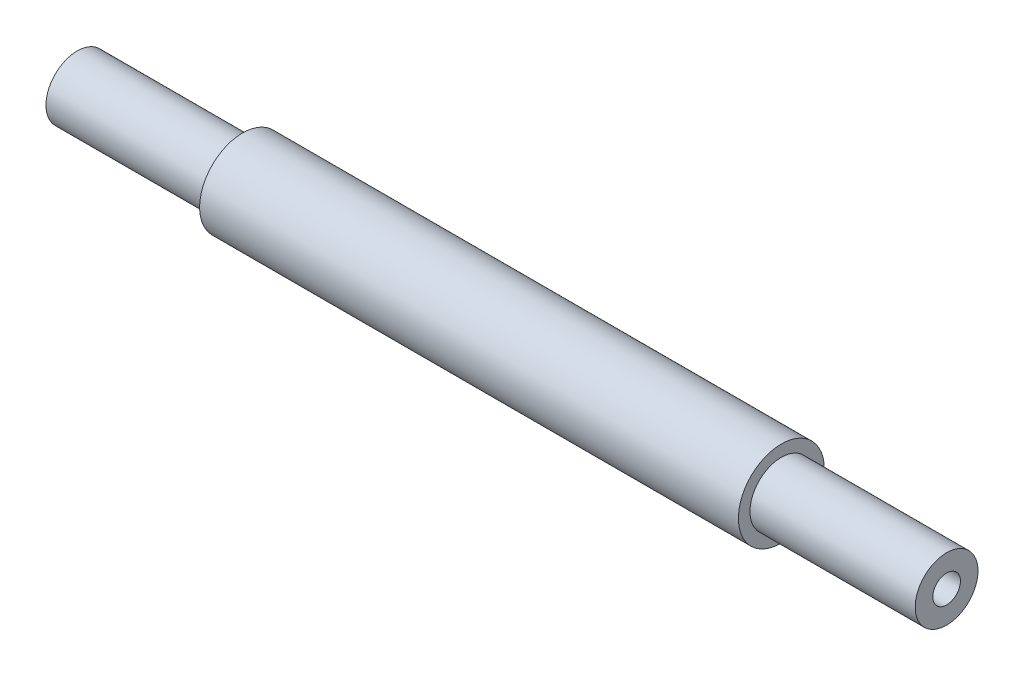
ISO-10303-21;
HEADER;
FILE_DESCRIPTION(('STEP AP214'),'2;1');
FILE_NAME('part.step','',(''),(''),'','','');
FILE_SCHEMA(('AUTOMOTIVE_DESIGN { 1 0 10303 214 1 1 1 1 }'));
ENDSEC;
DATA;
#1=APPLICATION_CONTEXT('core data for automotive mechanical design processes');
#2=APPLICATION_PROTOCOL_DEFINITION('international standard','automotive_design',2000,#1);
#3=PRODUCT_CONTEXT('',#1,'mechanical');
#4=PRODUCT('Part','Part','',(#3));
#5=PRODUCT_RELATED_PRODUCT_CATEGORY('part','',(#4));
#6=PRODUCT_DEFINITION_FORMATION('','',#4);
#7=PRODUCT_DEFINITION_CONTEXT('part definition',#1,'design');
#8=PRODUCT_DEFINITION('design','',#6,#7);
#9=PRODUCT_DEFINITION_SHAPE('','',#8);
#10=(LENGTH_UNIT() NAMED_UNIT(*) SI_UNIT(.MILLI.,.METRE.));
#11=(NAMED_UNIT(*) PLANE_ANGLE_UNIT() SI_UNIT($,.RADIAN.));
#12=(NAMED_UNIT(*) SI_UNIT($,.STERADIAN.) SOLID_ANGLE_UNIT());
#13=UNCERTAINTY_MEASURE_WITH_UNIT(LENGTH_MEASURE(1.E-05),#10,'distance_accuracy_value','');
#14=(GEOMETRIC_REPRESENTATION_CONTEXT(3) GLOBAL_UNCERTAINTY_ASSIGNED_CONTEXT((#13)) GLOBAL_UNIT_ASSIGNED_CONTEXT((#10,
#11,#12)) REPRESENTATION_CONTEXT('',''));
#15=CARTESIAN_POINT('',(0.,0.,0.));
#16=DIRECTION('',(0.,0.,1.));
#17=DIRECTION('',(1.,0.,0.));
#18=AXIS2_PLACEMENT_3D('',#15,#16,#17);
#19=CARTESIAN_POINT('',(2.63,0.,0.));
#20=DIRECTION('',(-1.,0.,0.));
#21=DIRECTION('',(0.,0.,1.));
#22=AXIS2_PLACEMENT_3D('',#19,#20,#21);
#23=CYLINDRICAL_SURFACE('',#22,0.095);
#24=CARTESIAN_POINT('',(0.,0.,0.));
#25=DIRECTION('',(1.,0.,0.));
#26=DIRECTION('',(0.,0.,-1.));
#27=AXIS2_PLACEMENT_3D('',#24,#25,#26);
#28=CIRCLE('',#27,0.095);
#29=CARTESIAN_POINT('',(0.,0.,-0.095));
#30=VERTEX_POINT('',#29);
#31=EDGE_CURVE('E47',#30,#30,#28,.T.);
#32=ORIENTED_EDGE('',*,*,#31,.T.);
#33=EDGE_LOOP('',(#32));
#34=FACE_BOUND('',#33,.T.);
#35=CARTESIAN_POINT('',(0.5,0.,0.));
#36=DIRECTION('',(1.,0.,0.));
#37=DIRECTION('',(0.,0.,-1.));
#38=AXIS2_PLACEMENT_3D('',#35,#36,#37);
#39=CIRCLE('',#38,0.095);
#40=CARTESIAN_POINT('',(0.5,0.,-0.095));
#41=VERTEX_POINT('',#40);
#42=EDGE_CURVE('E10',#41,#41,#39,.T.);
#43=ORIENTED_EDGE('',*,*,#42,.F.);
#44=EDGE_LOOP('',(#43));
#45=FACE_BOUND('',#44,.T.);
#46=ADVANCED_FACE('F31',(#34,#45),#23,.T.);
#47=CARTESIAN_POINT('',(2.63,0.,0.));
#48=DIRECTION('',(-1.,0.,0.));
#49=DIRECTION('',(0.,0.,1.));
#50=AXIS2_PLACEMENT_3D('',#47,#48,#49);
#51=CYLINDRICAL_SURFACE('',#50,0.0418128357990429);
#52=CARTESIAN_POINT('',(2.63,0.,0.));
#53=DIRECTION('',(1.,0.,0.));
#54=DIRECTION('',(0.,0.,-1.));
#55=AXIS2_PLACEMENT_3D('',#52,#53,#54);
#56=CIRCLE('',#55,0.0418128357990429);
#57=CARTESIAN_POINT('',(2.63,0.,-0.0418128357990429));
#58=VERTEX_POINT('',#57);
#59=EDGE_CURVE('E42',#58,#58,#56,.T.);
#60=ORIENTED_EDGE('',*,*,#59,.T.);
#61=EDGE_LOOP('',(#60));
#62=FACE_BOUND('',#61,.T.);
#63=CARTESIAN_POINT('',(0.,0.,0.));
#64=DIRECTION('',(1.,0.,0.));
#65=DIRECTION('',(0.,0.,-1.));
#66=AXIS2_PLACEMENT_3D('',#63,#64,#65);
#67=CIRCLE('',#66,0.0418128357990429);
#68=CARTESIAN_POINT('',(0.,0.,-0.0418128357990429));
#69=VERTEX_POINT('',#68);
#70=EDGE_CURVE('E51',#69,#69,#67,.T.);
#71=ORIENTED_EDGE('',*,*,#70,.F.);
#72=EDGE_LOOP('',(#71));
#73=FACE_BOUND('',#72,.T.);
#74=ADVANCED_FACE('F33',(#62,#73),#51,.F.);
#75=CARTESIAN_POINT('',(2.13,0.,0.));
#76=DIRECTION('',(1.,0.,0.));
#77=DIRECTION('',(0.,0.,-1.));
#78=AXIS2_PLACEMENT_3D('',#75,#76,#77);
#79=CIRCLE('',#78,0.095);
#80=CARTESIAN_POINT('',(2.13,0.,-0.095));
#81=VERTEX_POINT('',#80);
#82=EDGE_CURVE('E87',#81,#81,#79,.T.);
#83=ORIENTED_EDGE('',*,*,#82,.T.);
#84=EDGE_LOOP('',(#83));
#85=FACE_BOUND('',#84,.T.);
#86=CARTESIAN_POINT('',(2.63,0.,0.));
#87=DIRECTION('',(1.,0.,0.));
#88=DIRECTION('',(0.,0.,-1.));
#89=AXIS2_PLACEMENT_3D('',#86,#87,#88);
#90=CIRCLE('',#89,0.095);
#91=CARTESIAN_POINT('',(2.63,0.,-0.095));
#92=VERTEX_POINT('',#91);
#93=EDGE_CURVE('E38',#92,#92,#90,.T.);
#94=ORIENTED_EDGE('',*,*,#93,.F.);
#95=EDGE_LOOP('',(#94));
#96=FACE_BOUND('',#95,.T.);
#97=ADVANCED_FACE('F72',(#85,#96),#23,.T.);
#98=CARTESIAN_POINT('',(2.63,0.,0.));
#99=DIRECTION('',(1.,0.,0.));
#100=DIRECTION('',(0.,0.,-1.));
#101=AXIS2_PLACEMENT_3D('',#98,#99,#100);
#102=PLANE('',#101);
#103=ORIENTED_EDGE('',*,*,#59,.F.);
#104=EDGE_LOOP('',(#103));
#105=FACE_BOUND('',#104,.T.);
#106=ORIENTED_EDGE('',*,*,#93,.T.);
#107=EDGE_LOOP('',(#106));
#108=FACE_BOUND('',#107,.T.);
#109=ADVANCED_FACE('F62',(#105,#108),#102,.T.);
#110=CARTESIAN_POINT('',(0.,0.,0.));
#111=DIRECTION('',(1.,0.,0.));
#112=DIRECTION('',(0.,0.,-1.));
#113=AXIS2_PLACEMENT_3D('',#110,#111,#112);
#114=PLANE('',#113);
#115=ORIENTED_EDGE('',*,*,#70,.T.);
#116=EDGE_LOOP('',(#115));
#117=FACE_BOUND('',#116,.T.);
#118=ORIENTED_EDGE('',*,*,#31,.F.);
#119=EDGE_LOOP('',(#118));
#120=FACE_BOUND('',#119,.T.);
#121=ADVANCED_FACE('F59',(#117,#120),#114,.F.);
#122=CARTESIAN_POINT('',(2.13,0.,0.));
#123=DIRECTION('',(-1.,0.,0.));
#124=DIRECTION('',(0.,0.,1.));
#125=AXIS2_PLACEMENT_3D('',#122,#123,#124);
#126=CYLINDRICAL_SURFACE('',#125,0.13);
#127=CARTESIAN_POINT('',(2.13,0.,0.));
#128=DIRECTION('',(1.,0.,0.));
#129=DIRECTION('',(0.,0.,-1.));
#130=AXIS2_PLACEMENT_3D('',#127,#128,#129);
#131=CIRCLE('',#130,0.13);
#132=CARTESIAN_POINT('',(2.13,0.,-0.13));
#133=VERTEX_POINT('',#132);
#134=EDGE_CURVE('E53',#133,#133,#131,.T.);
#135=ORIENTED_EDGE('',*,*,#134,.F.);
#136=EDGE_LOOP('',(#135));
#137=FACE_BOUND('',#136,.T.);
#138=CARTESIAN_POINT('',(0.5,0.,0.));
#139=DIRECTION('',(1.,0.,0.));
#140=DIRECTION('',(0.,0.,-1.));
#141=AXIS2_PLACEMENT_3D('',#138,#139,#140);
#142=CIRCLE('',#141,0.13);
#143=CARTESIAN_POINT('',(0.5,0.,-0.13));
#144=VERTEX_POINT('',#143);
#145=EDGE_CURVE('E89',#144,#144,#142,.T.);
#146=ORIENTED_EDGE('',*,*,#145,.T.);
#147=EDGE_LOOP('',(#146));
#148=FACE_BOUND('',#147,.T.);
#149=ADVANCED_FACE('F61',(#137,#148),#126,.T.);
#150=CARTESIAN_POINT('',(2.13,0.,0.));
#151=DIRECTION('',(1.,0.,0.));
#152=DIRECTION('',(0.,0.,-1.));
#153=AXIS2_PLACEMENT_3D('',#150,#151,#152);
#154=PLANE('',#153);
#155=ORIENTED_EDGE('',*,*,#82,.F.);
#156=EDGE_LOOP('',(#155));
#157=FACE_BOUND('',#156,.T.);
#158=ORIENTED_EDGE('',*,*,#134,.T.);
#159=EDGE_LOOP('',(#158));
#160=FACE_BOUND('',#159,.T.);
#161=ADVANCED_FACE('F69',(#157,#160),#154,.T.);
#162=CARTESIAN_POINT('',(0.5,0.,0.));
#163=DIRECTION('',(1.,0.,0.));
#164=DIRECTION('',(0.,0.,-1.));
#165=AXIS2_PLACEMENT_3D('',#162,#163,#164);
#166=PLANE('',#165);
#167=ORIENTED_EDGE('',*,*,#42,.T.);
#168=EDGE_LOOP('',(#167));
#169=FACE_BOUND('',#168,.T.);
#170=ORIENTED_EDGE('',*,*,#145,.F.);
#171=EDGE_LOOP('',(#170));
#172=FACE_BOUND('',#171,.T.);
#173=ADVANCED_FACE('F97',(#169,#172),#166,.F.);
#174=CLOSED_SHELL('',(#46,#74,#97,#109,#121,#149,#161,#173));
#175=MANIFOLD_SOLID_BREP('B2',#174);
#176=ADVANCED_BREP_SHAPE_REPRESENTATION('',(#18,#175),#14);
#177=SHAPE_DEFINITION_REPRESENTATION(#9,#176);
ENDSEC;
END-ISO-10303-21;
